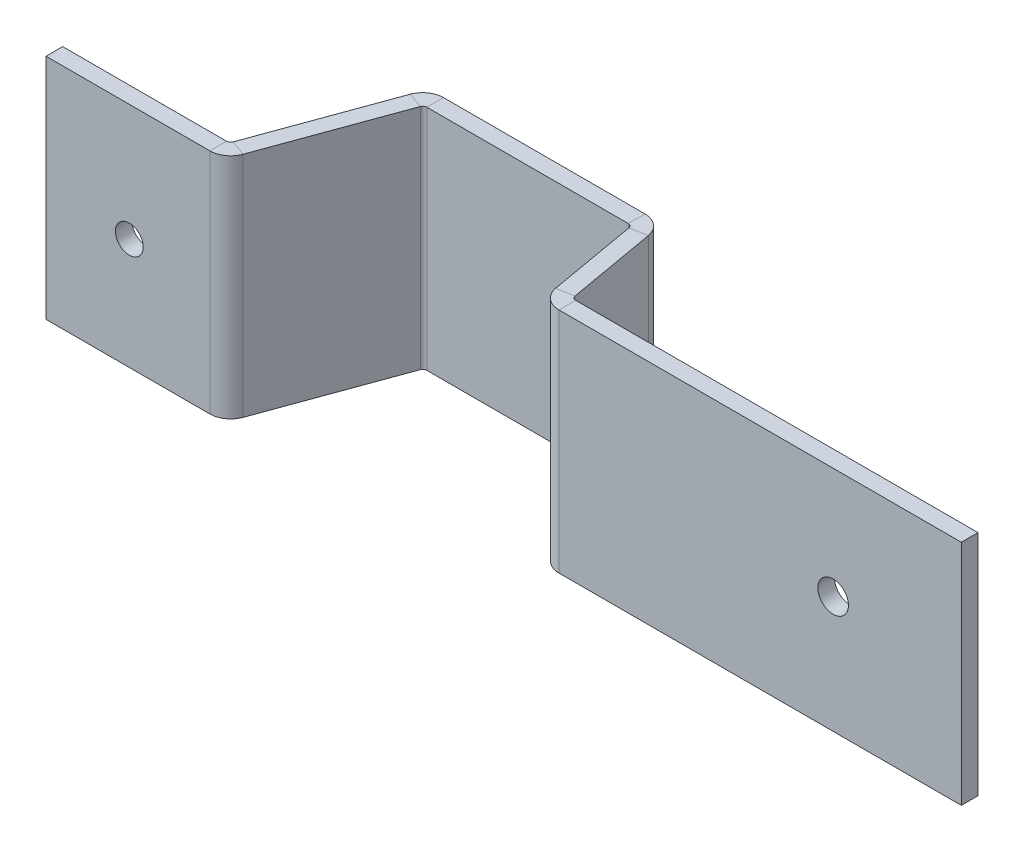
ISO-10303-21;
HEADER;
FILE_DESCRIPTION(('STEP AP214'),'2;1');
FILE_NAME('part.step','',(''),(''),'','','');
FILE_SCHEMA(('AUTOMOTIVE_DESIGN { 1 0 10303 214 1 1 1 1 }'));
ENDSEC;
DATA;
#1=APPLICATION_CONTEXT('core data for automotive mechanical design processes');
#2=APPLICATION_PROTOCOL_DEFINITION('international standard','automotive_design',2000,#1);
#3=PRODUCT_CONTEXT('',#1,'mechanical');
#4=PRODUCT('Part','Part','',(#3));
#5=PRODUCT_RELATED_PRODUCT_CATEGORY('part','',(#4));
#6=PRODUCT_DEFINITION_FORMATION('','',#4);
#7=PRODUCT_DEFINITION_CONTEXT('part definition',#1,'design');
#8=PRODUCT_DEFINITION('design','',#6,#7);
#9=PRODUCT_DEFINITION_SHAPE('','',#8);
#10=(LENGTH_UNIT() NAMED_UNIT(*) SI_UNIT(.MILLI.,.METRE.));
#11=(NAMED_UNIT(*) PLANE_ANGLE_UNIT() SI_UNIT($,.RADIAN.));
#12=(NAMED_UNIT(*) SI_UNIT($,.STERADIAN.) SOLID_ANGLE_UNIT());
#13=UNCERTAINTY_MEASURE_WITH_UNIT(LENGTH_MEASURE(1.E-05),#10,'distance_accuracy_value','');
#14=(GEOMETRIC_REPRESENTATION_CONTEXT(3) GLOBAL_UNCERTAINTY_ASSIGNED_CONTEXT((#13)) GLOBAL_UNIT_ASSIGNED_CONTEXT((#10,
#11,#12)) REPRESENTATION_CONTEXT('',''));
#15=CARTESIAN_POINT('',(0.,0.,0.));
#16=DIRECTION('',(0.,0.,1.));
#17=DIRECTION('',(1.,0.,0.));
#18=AXIS2_PLACEMENT_3D('',#15,#16,#17);
#19=CARTESIAN_POINT('',(30.1764047118256,41.,-0.484667962426315));
#20=DIRECTION('',(0.,1.,0.));
#21=DIRECTION('',(0.,0.,1.));
#22=AXIS2_PLACEMENT_3D('',#19,#20,#21);
#23=PLANE('',#22);
#24=DIRECTION('',(0.939692620785909,0.,0.342020143325666));
#25=VECTOR('',#24,1.);
#26=CARTESIAN_POINT('',(30.1764047118256,41.,-0.484667962426315));
#27=LINE('',#26,#25);
#28=CARTESIAN_POINT('',(30.1764047118256,41.,-0.484667962426315));
#29=VERTEX_POINT('',#28);
#30=CARTESIAN_POINT('',(32.9954825741834,41.,0.541392467550683));
#31=VERTEX_POINT('',#30);
#32=EDGE_CURVE('E11',#29,#31,#27,.T.);
#33=ORIENTED_EDGE('',*,*,#32,.F.);
#34=CARTESIAN_POINT('',(29.4842271273547,41.,-0.7366));
#35=DIRECTION('',(0.,-1.,0.));
#36=DIRECTION('',(0.,0.,-1.));
#37=AXIS2_PLACEMENT_3D('',#34,#35,#36);
#38=CIRCLE('',#37,0.7366);
#39=CARTESIAN_POINT('',(29.4842271273547,41.,0.));
#40=VERTEX_POINT('',#39);
#41=EDGE_CURVE('E368',#40,#29,#38,.F.);
#42=ORIENTED_EDGE('',*,*,#41,.F.);
#43=DIRECTION('',(0.,0.,-1.));
#44=VECTOR('',#43,1.);
#45=CARTESIAN_POINT('',(29.4842271273547,41.,3.));
#46=LINE('',#45,#44);
#47=CARTESIAN_POINT('',(29.4842271273547,41.,3.));
#48=VERTEX_POINT('',#47);
#49=EDGE_CURVE('E45',#48,#40,#46,.T.);
#50=ORIENTED_EDGE('',*,*,#49,.F.);
#51=CARTESIAN_POINT('',(29.4842271273547,41.,-0.7366));
#52=DIRECTION('',(0.,1.,0.));
#53=DIRECTION('',(1.,0.,0.));
#54=AXIS2_PLACEMENT_3D('',#51,#52,#53);
#55=CIRCLE('',#54,3.7366);
#56=EDGE_CURVE('E381',#48,#31,#55,.T.);
#57=ORIENTED_EDGE('',*,*,#56,.T.);
#58=EDGE_LOOP('',(#33,#42,#50,#57));
#59=FACE_BOUND('',#58,.T.);
#60=ADVANCED_FACE('F36',(#59),#23,.T.);
#61=CARTESIAN_POINT('',(29.4842271273547,41.,3.));
#62=DIRECTION('',(0.,1.,0.));
#63=DIRECTION('',(0.,0.,1.));
#64=AXIS2_PLACEMENT_3D('',#61,#62,#63);
#65=PLANE('',#64);
#66=DIRECTION('',(0.342020143325666,0.,-0.939692620785909));
#67=VECTOR('',#66,1.);
#68=CARTESIAN_POINT('',(30.,41.,0.));
#69=LINE('',#68,#67);
#70=CARTESIAN_POINT('',(38.6817040535644,41.,-23.8527858495562));
#71=VERTEX_POINT('',#70);
#72=EDGE_CURVE('E372',#29,#71,#69,.T.);
#73=ORIENTED_EDGE('',*,*,#72,.F.);
#74=ORIENTED_EDGE('',*,*,#32,.T.);
#75=DIRECTION('',(0.342020143325666,0.,-0.939692620785909));
#76=VECTOR('',#75,1.);
#77=CARTESIAN_POINT('',(32.8190778623577,41.,1.026060429977));
#78=LINE('',#77,#76);
#79=CARTESIAN_POINT('',(41.5007819159222,41.,-22.8267254195792));
#80=VERTEX_POINT('',#79);
#81=EDGE_CURVE('E383',#31,#80,#78,.T.);
#82=ORIENTED_EDGE('',*,*,#81,.T.);
#83=DIRECTION('',(-0.939692620785909,0.,-0.342020143325667));
#84=VECTOR('',#83,1.);
#85=CARTESIAN_POINT('',(41.5007819159222,41.,-22.8267254195792));
#86=LINE('',#85,#84);
#87=EDGE_CURVE('E341',#80,#71,#86,.T.);
#88=ORIENTED_EDGE('',*,*,#87,.T.);
#89=EDGE_LOOP('',(#73,#74,#82,#88));
#90=FACE_BOUND('',#89,.T.);
#91=ADVANCED_FACE('F453',(#90),#65,.T.);
#92=CARTESIAN_POINT('',(29.4842271273547,0.,0.));
#93=DIRECTION('',(0.,-1.,0.));
#94=DIRECTION('',(0.,0.,-1.));
#95=AXIS2_PLACEMENT_3D('',#92,#93,#94);
#96=PLANE('',#95);
#97=DIRECTION('',(0.,0.,1.));
#98=VECTOR('',#97,1.);
#99=CARTESIAN_POINT('',(29.4842271273547,0.,0.));
#100=LINE('',#99,#98);
#101=CARTESIAN_POINT('',(29.4842271273547,0.,0.));
#102=VERTEX_POINT('',#101);
#103=CARTESIAN_POINT('',(29.4842271273547,0.,3.));
#104=VERTEX_POINT('',#103);
#105=EDGE_CURVE('E347',#102,#104,#100,.T.);
#106=ORIENTED_EDGE('',*,*,#105,.F.);
#107=CARTESIAN_POINT('',(29.4842271273547,0.,-0.7366));
#108=DIRECTION('',(0.,-1.,0.));
#109=DIRECTION('',(0.,0.,-1.));
#110=AXIS2_PLACEMENT_3D('',#107,#108,#109);
#111=CIRCLE('',#110,0.7366);
#112=CARTESIAN_POINT('',(30.1764047118256,0.,-0.484667962426315));
#113=VERTEX_POINT('',#112);
#114=EDGE_CURVE('E251',#102,#113,#111,.F.);
#115=ORIENTED_EDGE('',*,*,#114,.T.);
#116=DIRECTION('',(-0.939692620785909,0.,-0.342020143325666));
#117=VECTOR('',#116,1.);
#118=CARTESIAN_POINT('',(32.9954825741834,0.,0.541392467550683));
#119=LINE('',#118,#117);
#120=CARTESIAN_POINT('',(32.9954825741834,0.,0.541392467550683));
#121=VERTEX_POINT('',#120);
#122=EDGE_CURVE('E345',#121,#113,#119,.T.);
#123=ORIENTED_EDGE('',*,*,#122,.F.);
#124=CARTESIAN_POINT('',(29.4842271273547,0.,-0.7366));
#125=DIRECTION('',(0.,1.,0.));
#126=DIRECTION('',(1.,0.,0.));
#127=AXIS2_PLACEMENT_3D('',#124,#125,#126);
#128=CIRCLE('',#127,3.7366);
#129=EDGE_CURVE('E263',#104,#121,#128,.T.);
#130=ORIENTED_EDGE('',*,*,#129,.F.);
#131=EDGE_LOOP('',(#106,#115,#123,#130));
#132=FACE_BOUND('',#131,.T.);
#133=ADVANCED_FACE('F495',(#132),#96,.T.);
#134=CARTESIAN_POINT('',(32.9954825741834,0.,0.541392467550683));
#135=DIRECTION('',(0.,-1.,0.));
#136=DIRECTION('',(0.,0.,-1.));
#137=AXIS2_PLACEMENT_3D('',#134,#135,#136);
#138=PLANE('',#137);
#139=DIRECTION('',(1.,0.,0.));
#140=VECTOR('',#139,1.);
#141=CARTESIAN_POINT('',(0.,0.,0.));
#142=LINE('',#141,#140);
#143=CARTESIAN_POINT('',(0.,0.,0.));
#144=VERTEX_POINT('',#143);
#145=EDGE_CURVE('E254',#144,#102,#142,.T.);
#146=ORIENTED_EDGE('',*,*,#145,.T.);
#147=ORIENTED_EDGE('',*,*,#105,.T.);
#148=DIRECTION('',(1.,0.,0.));
#149=VECTOR('',#148,1.);
#150=CARTESIAN_POINT('',(0.,0.,3.));
#151=LINE('',#150,#149);
#152=CARTESIAN_POINT('',(0.,0.,3.));
#153=VERTEX_POINT('',#152);
#154=EDGE_CURVE('E260',#153,#104,#151,.T.);
#155=ORIENTED_EDGE('',*,*,#154,.F.);
#156=DIRECTION('',(0.,0.,-1.));
#157=VECTOR('',#156,1.);
#158=CARTESIAN_POINT('',(0.,0.,3.));
#159=LINE('',#158,#157);
#160=EDGE_CURVE('E257',#153,#144,#159,.T.);
#161=ORIENTED_EDGE('',*,*,#160,.T.);
#162=EDGE_LOOP('',(#146,#147,#155,#161));
#163=FACE_BOUND('',#162,.T.);
#164=ADVANCED_FACE('F499',(#163),#138,.T.);
#165=CARTESIAN_POINT('',(42.1929595003931,41.,-26.3113933820055));
#166=DIRECTION('',(0.,1.,0.));
#167=DIRECTION('',(0.,0.,1.));
#168=AXIS2_PLACEMENT_3D('',#165,#166,#167);
#169=PLANE('',#168);
#170=DIRECTION('',(0.,0.,1.));
#171=VECTOR('',#170,1.);
#172=CARTESIAN_POINT('',(42.1929595003931,41.,-26.3113933820055));
#173=LINE('',#172,#171);
#174=CARTESIAN_POINT('',(42.1929595003931,41.,-26.3113933820055));
#175=VERTEX_POINT('',#174);
#176=CARTESIAN_POINT('',(42.1929595003931,41.,-23.3113933820055));
#177=VERTEX_POINT('',#176);
#178=EDGE_CURVE('E343',#175,#177,#173,.T.);
#179=ORIENTED_EDGE('',*,*,#178,.F.);
#180=CARTESIAN_POINT('',(42.1929595003931,41.,-22.5747933820055));
#181=DIRECTION('',(0.,1.,0.));
#182=DIRECTION('',(0.,0.,1.));
#183=AXIS2_PLACEMENT_3D('',#180,#181,#182);
#184=CIRCLE('',#183,3.7366);
#185=EDGE_CURVE('E443',#71,#175,#184,.F.);
#186=ORIENTED_EDGE('',*,*,#185,.F.);
#187=ORIENTED_EDGE('',*,*,#87,.F.);
#188=CARTESIAN_POINT('',(42.1929595003931,41.,-22.5747933820055));
#189=DIRECTION('',(0.,1.,0.));
#190=DIRECTION('',(1.,0.,0.));
#191=AXIS2_PLACEMENT_3D('',#188,#189,#190);
#192=CIRCLE('',#191,0.7366);
#193=EDGE_CURVE('E386',#80,#177,#192,.F.);
#194=ORIENTED_EDGE('',*,*,#193,.T.);
#195=EDGE_LOOP('',(#179,#186,#187,#194));
#196=FACE_BOUND('',#195,.T.);
#197=ADVANCED_FACE('F460',(#196),#169,.T.);
#198=CARTESIAN_POINT('',(41.5007819159222,41.,-22.8267254195792));
#199=DIRECTION('',(0.,1.,0.));
#200=DIRECTION('',(0.,0.,1.));
#201=AXIS2_PLACEMENT_3D('',#198,#199,#200);
#202=PLANE('',#201);
#203=DIRECTION('',(1.,0.,0.));
#204=VECTOR('',#203,1.);
#205=CARTESIAN_POINT('',(39.5765640131186,41.,-26.3113933820055));
#206=LINE('',#205,#204);
#207=CARTESIAN_POINT('',(78.4411843312616,41.,-26.3113933820055));
#208=VERTEX_POINT('',#207);
#209=EDGE_CURVE('E440',#175,#208,#206,.T.);
#210=ORIENTED_EDGE('',*,*,#209,.F.);
#211=ORIENTED_EDGE('',*,*,#178,.T.);
#212=DIRECTION('',(1.,0.,0.));
#213=VECTOR('',#212,1.);
#214=CARTESIAN_POINT('',(39.5765640131186,41.,-23.3113933820055));
#215=LINE('',#214,#213);
#216=CARTESIAN_POINT('',(78.4411843312616,41.,-23.3113933820055));
#217=VERTEX_POINT('',#216);
#218=EDGE_CURVE('E204',#177,#217,#215,.T.);
#219=ORIENTED_EDGE('',*,*,#218,.T.);
#220=DIRECTION('',(0.,0.,-1.));
#221=VECTOR('',#220,1.);
#222=CARTESIAN_POINT('',(78.4411843312616,41.,-23.3113933820055));
#223=LINE('',#222,#221);
#224=EDGE_CURVE('E195',#217,#208,#223,.T.);
#225=ORIENTED_EDGE('',*,*,#224,.T.);
#226=EDGE_LOOP('',(#210,#211,#219,#225));
#227=FACE_BOUND('',#226,.T.);
#228=ADVANCED_FACE('F392',(#227),#202,.T.);
#229=CARTESIAN_POINT('',(38.6817040535644,0.,-23.8527858495562));
#230=DIRECTION('',(0.,-1.,0.));
#231=DIRECTION('',(0.,0.,-1.));
#232=AXIS2_PLACEMENT_3D('',#229,#230,#231);
#233=PLANE('',#232);
#234=DIRECTION('',(0.939692620785909,0.,0.342020143325667));
#235=VECTOR('',#234,1.);
#236=CARTESIAN_POINT('',(38.6817040535644,0.,-23.8527858495562));
#237=LINE('',#236,#235);
#238=CARTESIAN_POINT('',(38.6817040535644,0.,-23.8527858495562));
#239=VERTEX_POINT('',#238);
#240=CARTESIAN_POINT('',(41.5007819159222,0.,-22.8267254195792));
#241=VERTEX_POINT('',#240);
#242=EDGE_CURVE('E339',#239,#241,#237,.T.);
#243=ORIENTED_EDGE('',*,*,#242,.F.);
#244=CARTESIAN_POINT('',(42.1929595003931,0.,-22.5747933820055));
#245=DIRECTION('',(0.,1.,0.));
#246=DIRECTION('',(0.,0.,1.));
#247=AXIS2_PLACEMENT_3D('',#244,#245,#246);
#248=CIRCLE('',#247,3.7366);
#249=CARTESIAN_POINT('',(42.1929595003931,0.,-26.3113933820055));
#250=VERTEX_POINT('',#249);
#251=EDGE_CURVE('E245',#239,#250,#248,.F.);
#252=ORIENTED_EDGE('',*,*,#251,.T.);
#253=DIRECTION('',(0.,0.,-1.));
#254=VECTOR('',#253,1.);
#255=CARTESIAN_POINT('',(42.1929595003931,0.,-23.3113933820055));
#256=LINE('',#255,#254);
#257=CARTESIAN_POINT('',(42.1929595003931,0.,-23.3113933820055));
#258=VERTEX_POINT('',#257);
#259=EDGE_CURVE('E194',#258,#250,#256,.T.);
#260=ORIENTED_EDGE('',*,*,#259,.F.);
#261=CARTESIAN_POINT('',(42.1929595003931,0.,-22.5747933820055));
#262=DIRECTION('',(0.,1.,0.));
#263=DIRECTION('',(1.,0.,0.));
#264=AXIS2_PLACEMENT_3D('',#261,#262,#263);
#265=CIRCLE('',#264,0.7366);
#266=EDGE_CURVE('E269',#241,#258,#265,.F.);
#267=ORIENTED_EDGE('',*,*,#266,.F.);
#268=EDGE_LOOP('',(#243,#252,#260,#267));
#269=FACE_BOUND('',#268,.T.);
#270=ADVANCED_FACE('F469',(#269),#233,.T.);
#271=CARTESIAN_POINT('',(42.1929595003931,0.,-23.3113933820055));
#272=DIRECTION('',(0.,-1.,0.));
#273=DIRECTION('',(0.,0.,-1.));
#274=AXIS2_PLACEMENT_3D('',#271,#272,#273);
#275=PLANE('',#274);
#276=DIRECTION('',(0.342020143325666,0.,-0.939692620785909));
#277=VECTOR('',#276,1.);
#278=CARTESIAN_POINT('',(30.,0.,0.));
#279=LINE('',#278,#277);
#280=EDGE_CURVE('E248',#113,#239,#279,.T.);
#281=ORIENTED_EDGE('',*,*,#280,.T.);
#282=ORIENTED_EDGE('',*,*,#242,.T.);
#283=DIRECTION('',(0.342020143325666,0.,-0.939692620785909));
#284=VECTOR('',#283,1.);
#285=CARTESIAN_POINT('',(32.8190778623577,0.,1.026060429977));
#286=LINE('',#285,#284);
#287=EDGE_CURVE('E266',#121,#241,#286,.T.);
#288=ORIENTED_EDGE('',*,*,#287,.F.);
#289=ORIENTED_EDGE('',*,*,#122,.T.);
#290=EDGE_LOOP('',(#281,#282,#288,#289));
#291=FACE_BOUND('',#290,.T.);
#292=ADVANCED_FACE('F473',(#291),#275,.T.);
#293=CARTESIAN_POINT('',(82.121016981167,41.,-23.2236471626757));
#294=DIRECTION('',(0.,1.,0.));
#295=DIRECTION('',(0.,0.,1.));
#296=AXIS2_PLACEMENT_3D('',#293,#294,#295);
#297=PLANE('',#296);
#298=DIRECTION('',(-0.984807753012208,0.,0.17364817766693));
#299=VECTOR('',#298,1.);
#300=CARTESIAN_POINT('',(82.121016981167,41.,-23.2236471626757));
#301=LINE('',#300,#299);
#302=CARTESIAN_POINT('',(82.121016981167,41.,-23.2236471626757));
#303=VERTEX_POINT('',#302);
#304=CARTESIAN_POINT('',(79.1665937221304,41.,-22.7027026296749));
#305=VERTEX_POINT('',#304);
#306=EDGE_CURVE('E182',#303,#305,#301,.T.);
#307=ORIENTED_EDGE('',*,*,#306,.F.);
#308=CARTESIAN_POINT('',(78.4411843312616,41.,-22.5747933820055));
#309=DIRECTION('',(0.,1.,0.));
#310=DIRECTION('',(0.,0.,1.));
#311=AXIS2_PLACEMENT_3D('',#308,#309,#310);
#312=CIRCLE('',#311,3.7366);
#313=EDGE_CURVE('E404',#208,#303,#312,.F.);
#314=ORIENTED_EDGE('',*,*,#313,.F.);
#315=ORIENTED_EDGE('',*,*,#224,.F.);
#316=CARTESIAN_POINT('',(78.4411843312616,41.,-22.5747933820055));
#317=DIRECTION('',(0.,1.,0.));
#318=DIRECTION('',(1.,0.,0.));
#319=AXIS2_PLACEMENT_3D('',#316,#317,#318);
#320=CIRCLE('',#319,0.7366);
#321=EDGE_CURVE('E198',#217,#305,#320,.F.);
#322=ORIENTED_EDGE('',*,*,#321,.T.);
#323=EDGE_LOOP('',(#307,#314,#315,#322));
#324=FACE_BOUND('',#323,.T.);
#325=ADVANCED_FACE('F200',(#324),#297,.T.);
#326=CARTESIAN_POINT('',(78.4411843312616,41.,-23.3113933820055));
#327=DIRECTION('',(0.,1.,0.));
#328=DIRECTION('',(0.,0.,1.));
#329=AXIS2_PLACEMENT_3D('',#326,#327,#328);
#330=PLANE('',#329);
#331=DIRECTION('',(0.173648177666928,0.,0.984807753012208));
#332=VECTOR('',#331,1.);
#333=CARTESIAN_POINT('',(81.5765640131187,41.,-26.3113933820055));
#334=LINE('',#333,#332);
#335=CARTESIAN_POINT('',(84.9421989639136,41.,-7.22392907409184));
#336=VERTEX_POINT('',#335);
#337=EDGE_CURVE('E189',#303,#336,#334,.T.);
#338=ORIENTED_EDGE('',*,*,#337,.F.);
#339=ORIENTED_EDGE('',*,*,#306,.T.);
#340=DIRECTION('',(0.173648177666928,0.,0.984807753012209));
#341=VECTOR('',#340,1.);
#342=CARTESIAN_POINT('',(78.622140754082,41.,-25.7904488490047));
#343=LINE('',#342,#341);
#344=CARTESIAN_POINT('',(81.987775704877,41.,-6.70298454109105));
#345=VERTEX_POINT('',#344);
#346=EDGE_CURVE('E186',#305,#345,#343,.T.);
#347=ORIENTED_EDGE('',*,*,#346,.T.);
#348=DIRECTION('',(0.984807753012208,0.,-0.17364817766693));
#349=VECTOR('',#348,1.);
#350=CARTESIAN_POINT('',(81.987775704877,41.,-6.70298454109105));
#351=LINE('',#350,#349);
#352=EDGE_CURVE('E330',#345,#336,#351,.T.);
#353=ORIENTED_EDGE('',*,*,#352,.T.);
#354=EDGE_LOOP('',(#338,#339,#347,#353));
#355=FACE_BOUND('',#354,.T.);
#356=ADVANCED_FACE('F184',(#355),#330,.T.);
#357=CARTESIAN_POINT('',(78.4411843312616,0.,-26.3113933820055));
#358=DIRECTION('',(0.,-1.,0.));
#359=DIRECTION('',(0.,0.,-1.));
#360=AXIS2_PLACEMENT_3D('',#357,#358,#359);
#361=PLANE('',#360);
#362=DIRECTION('',(0.,0.,1.));
#363=VECTOR('',#362,1.);
#364=CARTESIAN_POINT('',(78.4411843312616,0.,-26.3113933820055));
#365=LINE('',#364,#363);
#366=CARTESIAN_POINT('',(78.4411843312616,0.,-26.3113933820055));
#367=VERTEX_POINT('',#366);
#368=CARTESIAN_POINT('',(78.4411843312616,0.,-23.3113933820055));
#369=VERTEX_POINT('',#368);
#370=EDGE_CURVE('E335',#367,#369,#365,.T.);
#371=ORIENTED_EDGE('',*,*,#370,.F.);
#372=CARTESIAN_POINT('',(78.4411843312616,0.,-22.5747933820055));
#373=DIRECTION('',(0.,1.,0.));
#374=DIRECTION('',(0.,0.,1.));
#375=AXIS2_PLACEMENT_3D('',#372,#373,#374);
#376=CIRCLE('',#375,3.7366);
#377=CARTESIAN_POINT('',(82.121016981167,0.,-23.2236471626757));
#378=VERTEX_POINT('',#377);
#379=EDGE_CURVE('E239',#367,#378,#376,.F.);
#380=ORIENTED_EDGE('',*,*,#379,.T.);
#381=DIRECTION('',(0.984807753012208,0.,-0.17364817766693));
#382=VECTOR('',#381,1.);
#383=CARTESIAN_POINT('',(79.1665937221304,0.,-22.7027026296749));
#384=LINE('',#383,#382);
#385=CARTESIAN_POINT('',(79.1665937221304,0.,-22.7027026296749));
#386=VERTEX_POINT('',#385);
#387=EDGE_CURVE('E333',#386,#378,#384,.T.);
#388=ORIENTED_EDGE('',*,*,#387,.F.);
#389=CARTESIAN_POINT('',(78.4411843312616,0.,-22.5747933820055));
#390=DIRECTION('',(0.,1.,0.));
#391=DIRECTION('',(1.,0.,0.));
#392=AXIS2_PLACEMENT_3D('',#389,#390,#391);
#393=CIRCLE('',#392,0.7366);
#394=EDGE_CURVE('E211',#369,#386,#393,.F.);
#395=ORIENTED_EDGE('',*,*,#394,.F.);
#396=EDGE_LOOP('',(#371,#380,#388,#395));
#397=FACE_BOUND('',#396,.T.);
#398=ADVANCED_FACE('F398',(#397),#361,.T.);
#399=CARTESIAN_POINT('',(79.1665937221304,0.,-22.7027026296749));
#400=DIRECTION('',(0.,-1.,0.));
#401=DIRECTION('',(0.,0.,-1.));
#402=AXIS2_PLACEMENT_3D('',#399,#400,#401);
#403=PLANE('',#402);
#404=DIRECTION('',(1.,0.,0.));
#405=VECTOR('',#404,1.);
#406=CARTESIAN_POINT('',(39.5765640131186,0.,-26.3113933820055));
#407=LINE('',#406,#405);
#408=EDGE_CURVE('E242',#250,#367,#407,.T.);
#409=ORIENTED_EDGE('',*,*,#408,.T.);
#410=ORIENTED_EDGE('',*,*,#370,.T.);
#411=DIRECTION('',(1.,0.,0.));
#412=VECTOR('',#411,1.);
#413=CARTESIAN_POINT('',(39.5765640131186,0.,-23.3113933820055));
#414=LINE('',#413,#412);
#415=EDGE_CURVE('E272',#258,#369,#414,.T.);
#416=ORIENTED_EDGE('',*,*,#415,.F.);
#417=ORIENTED_EDGE('',*,*,#259,.T.);
#418=EDGE_LOOP('',(#409,#410,#416,#417));
#419=FACE_BOUND('',#418,.T.);
#420=ADVANCED_FACE('F479',(#419),#403,.T.);
#421=CARTESIAN_POINT('',(85.6676083547824,41.,-6.6152383217613));
#422=DIRECTION('',(0.,1.,0.));
#423=DIRECTION('',(0.,0.,1.));
#424=AXIS2_PLACEMENT_3D('',#421,#422,#423);
#425=PLANE('',#424);
#426=DIRECTION('',(0.,0.,1.));
#427=VECTOR('',#426,1.);
#428=CARTESIAN_POINT('',(85.6676083547824,41.,-6.6152383217613));
#429=LINE('',#428,#427);
#430=CARTESIAN_POINT('',(85.6676083547824,41.,-6.6152383217613));
#431=VERTEX_POINT('',#430);
#432=CARTESIAN_POINT('',(85.6676083547824,41.,-3.6152383217613));
#433=VERTEX_POINT('',#432);
#434=EDGE_CURVE('E53',#431,#433,#429,.T.);
#435=ORIENTED_EDGE('',*,*,#434,.F.);
#436=CARTESIAN_POINT('',(85.6676083547824,41.,-7.3518383217613));
#437=DIRECTION('',(0.,-1.,0.));
#438=DIRECTION('',(0.,0.,-1.));
#439=AXIS2_PLACEMENT_3D('',#436,#437,#438);
#440=CIRCLE('',#439,0.7366);
#441=EDGE_CURVE('E432',#336,#431,#440,.F.);
#442=ORIENTED_EDGE('',*,*,#441,.F.);
#443=ORIENTED_EDGE('',*,*,#352,.F.);
#444=CARTESIAN_POINT('',(85.6676083547824,41.,-7.3518383217613));
#445=DIRECTION('',(0.,1.,0.));
#446=DIRECTION('',(1.,0.,0.));
#447=AXIS2_PLACEMENT_3D('',#444,#445,#446);
#448=CIRCLE('',#447,3.7366);
#449=EDGE_CURVE('E219',#345,#433,#448,.T.);
#450=ORIENTED_EDGE('',*,*,#449,.T.);
#451=EDGE_LOOP('',(#435,#442,#443,#450));
#452=FACE_BOUND('',#451,.T.);
#453=ADVANCED_FACE('F481',(#452),#425,.T.);
#454=CARTESIAN_POINT('',(81.987775704877,41.,-6.70298454109105));
#455=DIRECTION('',(0.,1.,0.));
#456=DIRECTION('',(0.,0.,1.));
#457=AXIS2_PLACEMENT_3D('',#454,#455,#456);
#458=PLANE('',#457);
#459=DIRECTION('',(1.,0.,0.));
#460=VECTOR('',#459,1.);
#461=CARTESIAN_POINT('',(85.0495275664572,41.,-6.6152383217613));
#462=LINE('',#461,#460);
#463=CARTESIAN_POINT('',(158.049527566457,41.,-6.6152383217613));
#464=VERTEX_POINT('',#463);
#465=EDGE_CURVE('E430',#431,#464,#462,.T.);
#466=ORIENTED_EDGE('',*,*,#465,.F.);
#467=ORIENTED_EDGE('',*,*,#434,.T.);
#468=DIRECTION('',(1.,0.,0.));
#469=VECTOR('',#468,1.);
#470=CARTESIAN_POINT('',(85.0495275664572,41.,-3.6152383217613));
#471=LINE('',#470,#469);
#472=CARTESIAN_POINT('',(158.049527566457,41.,-3.6152383217613));
#473=VERTEX_POINT('',#472);
#474=EDGE_CURVE('E131',#433,#473,#471,.T.);
#475=ORIENTED_EDGE('',*,*,#474,.T.);
#476=DIRECTION('',(0.,0.,1.));
#477=VECTOR('',#476,1.);
#478=CARTESIAN_POINT('',(158.049527566457,41.,-6.6152383217613));
#479=LINE('',#478,#477);
#480=EDGE_CURVE('E428',#464,#473,#479,.T.);
#481=ORIENTED_EDGE('',*,*,#480,.F.);
#482=EDGE_LOOP('',(#466,#467,#475,#481));
#483=FACE_BOUND('',#482,.T.);
#484=ADVANCED_FACE('F487',(#483),#458,.T.);
#485=CARTESIAN_POINT('',(84.9421989639136,0.,-7.22392907409184));
#486=DIRECTION('',(0.,-1.,0.));
#487=DIRECTION('',(0.,0.,-1.));
#488=AXIS2_PLACEMENT_3D('',#485,#486,#487);
#489=PLANE('',#488);
#490=DIRECTION('',(-0.984807753012208,0.,0.17364817766693));
#491=VECTOR('',#490,1.);
#492=CARTESIAN_POINT('',(84.9421989639136,0.,-7.22392907409184));
#493=LINE('',#492,#491);
#494=CARTESIAN_POINT('',(84.9421989639136,0.,-7.22392907409184));
#495=VERTEX_POINT('',#494);
#496=CARTESIAN_POINT('',(81.987775704877,0.,-6.70298454109105));
#497=VERTEX_POINT('',#496);
#498=EDGE_CURVE('E118',#495,#497,#493,.T.);
#499=ORIENTED_EDGE('',*,*,#498,.F.);
#500=CARTESIAN_POINT('',(85.6676083547824,0.,-7.3518383217613));
#501=DIRECTION('',(0.,-1.,0.));
#502=DIRECTION('',(0.,0.,-1.));
#503=AXIS2_PLACEMENT_3D('',#500,#501,#502);
#504=CIRCLE('',#503,0.7366);
#505=CARTESIAN_POINT('',(85.6676083547824,0.,-6.6152383217613));
#506=VERTEX_POINT('',#505);
#507=EDGE_CURVE('E235',#495,#506,#504,.F.);
#508=ORIENTED_EDGE('',*,*,#507,.T.);
#509=DIRECTION('',(0.,0.,-1.));
#510=VECTOR('',#509,1.);
#511=CARTESIAN_POINT('',(85.6676083547824,0.,-3.6152383217613));
#512=LINE('',#511,#510);
#513=CARTESIAN_POINT('',(85.6676083547824,0.,-3.6152383217613));
#514=VERTEX_POINT('',#513);
#515=EDGE_CURVE('E125',#514,#506,#512,.T.);
#516=ORIENTED_EDGE('',*,*,#515,.F.);
#517=CARTESIAN_POINT('',(85.6676083547824,0.,-7.3518383217613));
#518=DIRECTION('',(0.,1.,0.));
#519=DIRECTION('',(1.,0.,0.));
#520=AXIS2_PLACEMENT_3D('',#517,#518,#519);
#521=CIRCLE('',#520,3.7366);
#522=EDGE_CURVE('E278',#497,#514,#521,.T.);
#523=ORIENTED_EDGE('',*,*,#522,.F.);
#524=EDGE_LOOP('',(#499,#508,#516,#523));
#525=FACE_BOUND('',#524,.T.);
#526=ADVANCED_FACE('F415',(#525),#489,.T.);
#527=CARTESIAN_POINT('',(85.6676083547824,0.,-3.6152383217613));
#528=DIRECTION('',(0.,-1.,0.));
#529=DIRECTION('',(0.,0.,-1.));
#530=AXIS2_PLACEMENT_3D('',#527,#528,#529);
#531=PLANE('',#530);
#532=DIRECTION('',(0.173648177666928,0.,0.984807753012208));
#533=VECTOR('',#532,1.);
#534=CARTESIAN_POINT('',(81.5765640131187,0.,-26.3113933820055));
#535=LINE('',#534,#533);
#536=EDGE_CURVE('E237',#378,#495,#535,.T.);
#537=ORIENTED_EDGE('',*,*,#536,.T.);
#538=ORIENTED_EDGE('',*,*,#498,.T.);
#539=DIRECTION('',(0.173648177666928,0.,0.984807753012209));
#540=VECTOR('',#539,1.);
#541=CARTESIAN_POINT('',(78.622140754082,0.,-25.7904488490047));
#542=LINE('',#541,#540);
#543=EDGE_CURVE('E276',#386,#497,#542,.T.);
#544=ORIENTED_EDGE('',*,*,#543,.F.);
#545=ORIENTED_EDGE('',*,*,#387,.T.);
#546=EDGE_LOOP('',(#537,#538,#544,#545));
#547=FACE_BOUND('',#546,.T.);
#548=ADVANCED_FACE('F400',(#547),#531,.T.);
#549=CARTESIAN_POINT('',(85.0495275664572,41.,-3.6152383217613));
#550=DIRECTION('',(0.,0.,-1.));
#551=DIRECTION('',(-1.,0.,0.));
#552=AXIS2_PLACEMENT_3D('',#549,#550,#551);
#553=PLANE('',#552);
#554=CARTESIAN_POINT('',(134.991664350565,21.,-3.6152383217613));
#555=DIRECTION('',(0.,0.,1.));
#556=DIRECTION('',(1.,0.,0.));
#557=AXIS2_PLACEMENT_3D('',#554,#555,#556);
#558=CIRCLE('',#557,2.75000000000001);
#559=CARTESIAN_POINT('',(137.741664350565,21.,-3.6152383217613));
#560=VERTEX_POINT('',#559);
#561=EDGE_CURVE('E904',#560,#560,#558,.T.);
#562=ORIENTED_EDGE('',*,*,#561,.F.);
#563=EDGE_LOOP('',(#562));
#564=FACE_BOUND('',#563,.T.);
#565=DIRECTION('',(1.,0.,0.));
#566=VECTOR('',#565,1.);
#567=CARTESIAN_POINT('',(85.0495275664572,0.,-3.6152383217613));
#568=LINE('',#567,#566);
#569=CARTESIAN_POINT('',(158.049527566457,0.,-3.6152383217613));
#570=VERTEX_POINT('',#569);
#571=EDGE_CURVE('E225',#514,#570,#568,.T.);
#572=ORIENTED_EDGE('',*,*,#571,.T.);
#573=DIRECTION('',(0.,-1.,0.));
#574=VECTOR('',#573,1.);
#575=CARTESIAN_POINT('',(158.049527566457,41.,-3.6152383217613));
#576=LINE('',#575,#574);
#577=EDGE_CURVE('E326',#473,#570,#576,.T.);
#578=ORIENTED_EDGE('',*,*,#577,.F.);
#579=ORIENTED_EDGE('',*,*,#474,.F.);
#580=DIRECTION('',(0.,-1.,0.));
#581=VECTOR('',#580,1.);
#582=CARTESIAN_POINT('',(85.6676083547824,41.,-3.6152383217613));
#583=LINE('',#582,#581);
#584=EDGE_CURVE('E221',#433,#514,#583,.T.);
#585=ORIENTED_EDGE('',*,*,#584,.T.);
#586=EDGE_LOOP('',(#572,#578,#579,#585));
#587=FACE_BOUND('',#586,.T.);
#588=ADVANCED_FACE('F421',(#564,#587),#553,.F.);
#589=CARTESIAN_POINT('',(158.049527566457,41.,-6.6152383217613));
#590=DIRECTION('',(1.,0.,0.));
#591=DIRECTION('',(0.,0.,-1.));
#592=AXIS2_PLACEMENT_3D('',#589,#590,#591);
#593=PLANE('',#592);
#594=DIRECTION('',(0.,0.,1.));
#595=VECTOR('',#594,1.);
#596=CARTESIAN_POINT('',(158.049527566457,0.,-6.6152383217613));
#597=LINE('',#596,#595);
#598=CARTESIAN_POINT('',(158.049527566457,0.,-6.6152383217613));
#599=VERTEX_POINT('',#598);
#600=EDGE_CURVE('E228',#599,#570,#597,.T.);
#601=ORIENTED_EDGE('',*,*,#600,.F.);
#602=DIRECTION('',(0.,-1.,0.));
#603=VECTOR('',#602,1.);
#604=CARTESIAN_POINT('',(158.049527566457,41.,-6.6152383217613));
#605=LINE('',#604,#603);
#606=EDGE_CURVE('E324',#464,#599,#605,.T.);
#607=ORIENTED_EDGE('',*,*,#606,.F.);
#608=ORIENTED_EDGE('',*,*,#480,.T.);
#609=ORIENTED_EDGE('',*,*,#577,.T.);
#610=EDGE_LOOP('',(#601,#607,#608,#609));
#611=FACE_BOUND('',#610,.T.);
#612=ADVANCED_FACE('F426',(#611),#593,.T.);
#613=CARTESIAN_POINT('',(85.0495275664572,41.,-6.6152383217613));
#614=DIRECTION('',(0.,0.,-1.));
#615=DIRECTION('',(-1.,0.,0.));
#616=AXIS2_PLACEMENT_3D('',#613,#614,#615);
#617=PLANE('',#616);
#618=CARTESIAN_POINT('',(134.991664350565,21.,-6.6152383217613));
#619=DIRECTION('',(0.,0.,-1.));
#620=DIRECTION('',(-1.,0.,0.));
#621=AXIS2_PLACEMENT_3D('',#618,#619,#620);
#622=CIRCLE('',#621,2.75000000000001);
#623=CARTESIAN_POINT('',(132.241664350565,21.,-6.6152383217613));
#624=VERTEX_POINT('',#623);
#625=EDGE_CURVE('E39',#624,#624,#622,.T.);
#626=ORIENTED_EDGE('',*,*,#625,.F.);
#627=EDGE_LOOP('',(#626));
#628=FACE_BOUND('',#627,.T.);
#629=DIRECTION('',(1.,0.,0.));
#630=VECTOR('',#629,1.);
#631=CARTESIAN_POINT('',(85.0495275664572,0.,-6.6152383217613));
#632=LINE('',#631,#630);
#633=EDGE_CURVE('E232',#506,#599,#632,.T.);
#634=ORIENTED_EDGE('',*,*,#633,.F.);
#635=DIRECTION('',(0.,-1.,0.));
#636=VECTOR('',#635,1.);
#637=CARTESIAN_POINT('',(85.6676083547824,41.,-6.6152383217613));
#638=LINE('',#637,#636);
#639=EDGE_CURVE('E321',#431,#506,#638,.T.);
#640=ORIENTED_EDGE('',*,*,#639,.F.);
#641=ORIENTED_EDGE('',*,*,#465,.T.);
#642=ORIENTED_EDGE('',*,*,#606,.T.);
#643=EDGE_LOOP('',(#634,#640,#641,#642));
#644=FACE_BOUND('',#643,.T.);
#645=ADVANCED_FACE('F576',(#628,#644),#617,.T.);
#646=CARTESIAN_POINT('',(85.6676083547824,41.,-7.3518383217613));
#647=DIRECTION('',(0.,-1.,0.));
#648=DIRECTION('',(0.,0.,-1.));
#649=AXIS2_PLACEMENT_3D('',#646,#647,#648);
#650=CYLINDRICAL_SURFACE('',#649,0.7366);
#651=ORIENTED_EDGE('',*,*,#507,.F.);
#652=DIRECTION('',(0.,-1.,0.));
#653=VECTOR('',#652,1.);
#654=CARTESIAN_POINT('',(84.9421989639136,41.,-7.22392907409184));
#655=LINE('',#654,#653);
#656=EDGE_CURVE('E318',#336,#495,#655,.T.);
#657=ORIENTED_EDGE('',*,*,#656,.F.);
#658=ORIENTED_EDGE('',*,*,#441,.T.);
#659=ORIENTED_EDGE('',*,*,#639,.T.);
#660=EDGE_LOOP('',(#651,#657,#658,#659));
#661=FACE_BOUND('',#660,.T.);
#662=ADVANCED_FACE('F412',(#661),#650,.F.);
#663=CARTESIAN_POINT('',(81.5765640131187,41.,-26.3113933820055));
#664=DIRECTION('',(0.984807753012208,0.,-0.173648177666928));
#665=DIRECTION('',(-0.173648177666928,0.,-0.984807753012208));
#666=AXIS2_PLACEMENT_3D('',#663,#664,#665);
#667=PLANE('',#666);
#668=ORIENTED_EDGE('',*,*,#536,.F.);
#669=DIRECTION('',(0.,-1.,0.));
#670=VECTOR('',#669,1.);
#671=CARTESIAN_POINT('',(82.121016981167,41.,-23.2236471626757));
#672=LINE('',#671,#670);
#673=EDGE_CURVE('E315',#303,#378,#672,.T.);
#674=ORIENTED_EDGE('',*,*,#673,.F.);
#675=ORIENTED_EDGE('',*,*,#337,.T.);
#676=ORIENTED_EDGE('',*,*,#656,.T.);
#677=EDGE_LOOP('',(#668,#674,#675,#676));
#678=FACE_BOUND('',#677,.T.);
#679=ADVANCED_FACE('F406',(#678),#667,.T.);
#680=CARTESIAN_POINT('',(78.4411843312616,41.,-22.5747933820055));
#681=DIRECTION('',(0.,-1.,0.));
#682=DIRECTION('',(0.,0.,-1.));
#683=AXIS2_PLACEMENT_3D('',#680,#681,#682);
#684=CYLINDRICAL_SURFACE('',#683,3.7366);
#685=ORIENTED_EDGE('',*,*,#379,.F.);
#686=DIRECTION('',(0.,-1.,0.));
#687=VECTOR('',#686,1.);
#688=CARTESIAN_POINT('',(78.4411843312616,41.,-26.3113933820055));
#689=LINE('',#688,#687);
#690=EDGE_CURVE('E312',#208,#367,#689,.T.);
#691=ORIENTED_EDGE('',*,*,#690,.F.);
#692=ORIENTED_EDGE('',*,*,#313,.T.);
#693=ORIENTED_EDGE('',*,*,#673,.T.);
#694=EDGE_LOOP('',(#685,#691,#692,#693));
#695=FACE_BOUND('',#694,.T.);
#696=ADVANCED_FACE('F403',(#695),#684,.T.);
#697=CARTESIAN_POINT('',(39.5765640131186,41.,-26.3113933820055));
#698=DIRECTION('',(0.,0.,-1.));
#699=DIRECTION('',(-1.,0.,0.));
#700=AXIS2_PLACEMENT_3D('',#697,#698,#699);
#701=PLANE('',#700);
#702=ORIENTED_EDGE('',*,*,#408,.F.);
#703=DIRECTION('',(0.,-1.,0.));
#704=VECTOR('',#703,1.);
#705=CARTESIAN_POINT('',(42.1929595003931,41.,-26.3113933820055));
#706=LINE('',#705,#704);
#707=EDGE_CURVE('E309',#175,#250,#706,.T.);
#708=ORIENTED_EDGE('',*,*,#707,.F.);
#709=ORIENTED_EDGE('',*,*,#209,.T.);
#710=ORIENTED_EDGE('',*,*,#690,.T.);
#711=EDGE_LOOP('',(#702,#708,#709,#710));
#712=FACE_BOUND('',#711,.T.);
#713=ADVANCED_FACE('F466',(#712),#701,.T.);
#714=CARTESIAN_POINT('',(42.1929595003931,41.,-22.5747933820055));
#715=DIRECTION('',(0.,-1.,0.));
#716=DIRECTION('',(0.,0.,-1.));
#717=AXIS2_PLACEMENT_3D('',#714,#715,#716);
#718=CYLINDRICAL_SURFACE('',#717,3.7366);
#719=ORIENTED_EDGE('',*,*,#251,.F.);
#720=DIRECTION('',(0.,-1.,0.));
#721=VECTOR('',#720,1.);
#722=CARTESIAN_POINT('',(38.6817040535644,41.,-23.8527858495562));
#723=LINE('',#722,#721);
#724=EDGE_CURVE('E306',#71,#239,#723,.T.);
#725=ORIENTED_EDGE('',*,*,#724,.F.);
#726=ORIENTED_EDGE('',*,*,#185,.T.);
#727=ORIENTED_EDGE('',*,*,#707,.T.);
#728=EDGE_LOOP('',(#719,#725,#726,#727));
#729=FACE_BOUND('',#728,.T.);
#730=ADVANCED_FACE('F459',(#729),#718,.T.);
#731=CARTESIAN_POINT('',(30.,41.,0.));
#732=DIRECTION('',(-0.939692620785909,0.,-0.342020143325666));
#733=DIRECTION('',(-0.342020143325666,0.,0.939692620785909));
#734=AXIS2_PLACEMENT_3D('',#731,#732,#733);
#735=PLANE('',#734);
#736=ORIENTED_EDGE('',*,*,#280,.F.);
#737=DIRECTION('',(0.,-1.,0.));
#738=VECTOR('',#737,1.);
#739=CARTESIAN_POINT('',(30.1764047118256,41.,-0.484667962426315));
#740=LINE('',#739,#738);
#741=EDGE_CURVE('E303',#29,#113,#740,.T.);
#742=ORIENTED_EDGE('',*,*,#741,.F.);
#743=ORIENTED_EDGE('',*,*,#72,.T.);
#744=ORIENTED_EDGE('',*,*,#724,.T.);
#745=EDGE_LOOP('',(#736,#742,#743,#744));
#746=FACE_BOUND('',#745,.T.);
#747=ADVANCED_FACE('F449',(#746),#735,.T.);
#748=CARTESIAN_POINT('',(29.4842271273547,41.,-0.7366));
#749=DIRECTION('',(0.,-1.,0.));
#750=DIRECTION('',(0.,0.,-1.));
#751=AXIS2_PLACEMENT_3D('',#748,#749,#750);
#752=CYLINDRICAL_SURFACE('',#751,0.7366);
#753=ORIENTED_EDGE('',*,*,#114,.F.);
#754=DIRECTION('',(0.,-1.,0.));
#755=VECTOR('',#754,1.);
#756=CARTESIAN_POINT('',(29.4842271273547,41.,0.));
#757=LINE('',#756,#755);
#758=EDGE_CURVE('E300',#40,#102,#757,.T.);
#759=ORIENTED_EDGE('',*,*,#758,.F.);
#760=ORIENTED_EDGE('',*,*,#41,.T.);
#761=ORIENTED_EDGE('',*,*,#741,.T.);
#762=EDGE_LOOP('',(#753,#759,#760,#761));
#763=FACE_BOUND('',#762,.T.);
#764=ADVANCED_FACE('F367',(#763),#752,.F.);
#765=CARTESIAN_POINT('',(0.,41.,0.));
#766=DIRECTION('',(0.,0.,-1.));
#767=DIRECTION('',(-1.,0.,0.));
#768=AXIS2_PLACEMENT_3D('',#765,#766,#767);
#769=PLANE('',#768);
#770=CARTESIAN_POINT('',(14.9916643505649,20.,0.));
#771=DIRECTION('',(0.,0.,-1.));
#772=DIRECTION('',(-1.,0.,0.));
#773=AXIS2_PLACEMENT_3D('',#770,#771,#772);
#774=CIRCLE('',#773,2.5);
#775=CARTESIAN_POINT('',(12.491664350565,20.,0.));
#776=VERTEX_POINT('',#775);
#777=EDGE_CURVE('E229',#776,#776,#774,.T.);
#778=ORIENTED_EDGE('',*,*,#777,.F.);
#779=EDGE_LOOP('',(#778));
#780=FACE_BOUND('',#779,.T.);
#781=ORIENTED_EDGE('',*,*,#145,.F.);
#782=DIRECTION('',(0.,-1.,0.));
#783=VECTOR('',#782,1.);
#784=CARTESIAN_POINT('',(0.,41.,0.));
#785=LINE('',#784,#783);
#786=CARTESIAN_POINT('',(0.,41.,0.));
#787=VERTEX_POINT('',#786);
#788=EDGE_CURVE('E298',#787,#144,#785,.T.);
#789=ORIENTED_EDGE('',*,*,#788,.F.);
#790=DIRECTION('',(1.,0.,0.));
#791=VECTOR('',#790,1.);
#792=CARTESIAN_POINT('',(0.,41.,0.));
#793=LINE('',#792,#791);
#794=EDGE_CURVE('E356',#787,#40,#793,.T.);
#795=ORIENTED_EDGE('',*,*,#794,.T.);
#796=ORIENTED_EDGE('',*,*,#758,.T.);
#797=EDGE_LOOP('',(#781,#789,#795,#796));
#798=FACE_BOUND('',#797,.T.);
#799=ADVANCED_FACE('F374',(#780,#798),#769,.T.);
#800=CARTESIAN_POINT('',(0.,41.,3.));
#801=DIRECTION('',(-1.,0.,0.));
#802=DIRECTION('',(0.,0.,1.));
#803=AXIS2_PLACEMENT_3D('',#800,#801,#802);
#804=PLANE('',#803);
#805=ORIENTED_EDGE('',*,*,#160,.F.);
#806=DIRECTION('',(0.,-1.,0.));
#807=VECTOR('',#806,1.);
#808=CARTESIAN_POINT('',(0.,41.,3.));
#809=LINE('',#808,#807);
#810=CARTESIAN_POINT('',(0.,41.,3.));
#811=VERTEX_POINT('',#810);
#812=EDGE_CURVE('E296',#811,#153,#809,.T.);
#813=ORIENTED_EDGE('',*,*,#812,.F.);
#814=DIRECTION('',(0.,0.,-1.));
#815=VECTOR('',#814,1.);
#816=CARTESIAN_POINT('',(0.,41.,3.));
#817=LINE('',#816,#815);
#818=EDGE_CURVE('E375',#811,#787,#817,.T.);
#819=ORIENTED_EDGE('',*,*,#818,.T.);
#820=ORIENTED_EDGE('',*,*,#788,.T.);
#821=EDGE_LOOP('',(#805,#813,#819,#820));
#822=FACE_BOUND('',#821,.T.);
#823=ADVANCED_FACE('F649',(#822),#804,.T.);
#824=CARTESIAN_POINT('',(0.,41.,3.));
#825=DIRECTION('',(0.,0.,-1.));
#826=DIRECTION('',(-1.,0.,0.));
#827=AXIS2_PLACEMENT_3D('',#824,#825,#826);
#828=PLANE('',#827);
#829=CARTESIAN_POINT('',(14.9916643505649,20.,3.));
#830=DIRECTION('',(0.,0.,1.));
#831=DIRECTION('',(1.,0.,0.));
#832=AXIS2_PLACEMENT_3D('',#829,#830,#831);
#833=CIRCLE('',#832,2.5);
#834=CARTESIAN_POINT('',(17.4916643505649,20.,3.));
#835=VERTEX_POINT('',#834);
#836=EDGE_CURVE('E906',#835,#835,#833,.T.);
#837=ORIENTED_EDGE('',*,*,#836,.F.);
#838=EDGE_LOOP('',(#837));
#839=FACE_BOUND('',#838,.T.);
#840=ORIENTED_EDGE('',*,*,#154,.T.);
#841=DIRECTION('',(0.,-1.,0.));
#842=VECTOR('',#841,1.);
#843=CARTESIAN_POINT('',(29.4842271273547,41.,3.));
#844=LINE('',#843,#842);
#845=EDGE_CURVE('E293',#48,#104,#844,.T.);
#846=ORIENTED_EDGE('',*,*,#845,.F.);
#847=DIRECTION('',(1.,0.,0.));
#848=VECTOR('',#847,1.);
#849=CARTESIAN_POINT('',(0.,41.,3.));
#850=LINE('',#849,#848);
#851=EDGE_CURVE('E359',#811,#48,#850,.T.);
#852=ORIENTED_EDGE('',*,*,#851,.F.);
#853=ORIENTED_EDGE('',*,*,#812,.T.);
#854=EDGE_LOOP('',(#840,#846,#852,#853));
#855=FACE_BOUND('',#854,.T.);
#856=ADVANCED_FACE('F654',(#839,#855),#828,.F.);
#857=CARTESIAN_POINT('',(29.4842271273547,41.,-0.7366));
#858=DIRECTION('',(0.,-1.,0.));
#859=DIRECTION('',(0.,0.,-1.));
#860=AXIS2_PLACEMENT_3D('',#857,#858,#859);
#861=CYLINDRICAL_SURFACE('',#860,3.7366);
#862=ORIENTED_EDGE('',*,*,#129,.T.);
#863=DIRECTION('',(0.,-1.,0.));
#864=VECTOR('',#863,1.);
#865=CARTESIAN_POINT('',(32.9954825741834,41.,0.541392467550683));
#866=LINE('',#865,#864);
#867=EDGE_CURVE('E290',#31,#121,#866,.T.);
#868=ORIENTED_EDGE('',*,*,#867,.F.);
#869=ORIENTED_EDGE('',*,*,#56,.F.);
#870=ORIENTED_EDGE('',*,*,#845,.T.);
#871=EDGE_LOOP('',(#862,#868,#869,#870));
#872=FACE_BOUND('',#871,.T.);
#873=ADVANCED_FACE('F663',(#872),#861,.T.);
#874=CARTESIAN_POINT('',(32.8190778623577,41.,1.026060429977));
#875=DIRECTION('',(-0.939692620785909,0.,-0.342020143325666));
#876=DIRECTION('',(-0.342020143325666,0.,0.939692620785909));
#877=AXIS2_PLACEMENT_3D('',#874,#875,#876);
#878=PLANE('',#877);
#879=ORIENTED_EDGE('',*,*,#287,.T.);
#880=DIRECTION('',(0.,-1.,0.));
#881=VECTOR('',#880,1.);
#882=CARTESIAN_POINT('',(41.5007819159222,41.,-22.8267254195792));
#883=LINE('',#882,#881);
#884=EDGE_CURVE('E287',#80,#241,#883,.T.);
#885=ORIENTED_EDGE('',*,*,#884,.F.);
#886=ORIENTED_EDGE('',*,*,#81,.F.);
#887=ORIENTED_EDGE('',*,*,#867,.T.);
#888=EDGE_LOOP('',(#879,#885,#886,#887));
#889=FACE_BOUND('',#888,.T.);
#890=ADVANCED_FACE('F475',(#889),#878,.F.);
#891=CARTESIAN_POINT('',(42.1929595003931,41.,-22.5747933820055));
#892=DIRECTION('',(0.,-1.,0.));
#893=DIRECTION('',(0.,0.,-1.));
#894=AXIS2_PLACEMENT_3D('',#891,#892,#893);
#895=CYLINDRICAL_SURFACE('',#894,0.7366);
#896=ORIENTED_EDGE('',*,*,#266,.T.);
#897=DIRECTION('',(0.,-1.,0.));
#898=VECTOR('',#897,1.);
#899=CARTESIAN_POINT('',(42.1929595003931,41.,-23.3113933820055));
#900=LINE('',#899,#898);
#901=EDGE_CURVE('E284',#177,#258,#900,.T.);
#902=ORIENTED_EDGE('',*,*,#901,.F.);
#903=ORIENTED_EDGE('',*,*,#193,.F.);
#904=ORIENTED_EDGE('',*,*,#884,.T.);
#905=EDGE_LOOP('',(#896,#902,#903,#904));
#906=FACE_BOUND('',#905,.T.);
#907=ADVANCED_FACE('F478',(#906),#895,.F.);
#908=CARTESIAN_POINT('',(39.5765640131186,41.,-23.3113933820055));
#909=DIRECTION('',(0.,0.,-1.));
#910=DIRECTION('',(-1.,0.,0.));
#911=AXIS2_PLACEMENT_3D('',#908,#909,#910);
#912=PLANE('',#911);
#913=ORIENTED_EDGE('',*,*,#415,.T.);
#914=DIRECTION('',(0.,-1.,0.));
#915=VECTOR('',#914,1.);
#916=CARTESIAN_POINT('',(78.4411843312616,41.,-23.3113933820055));
#917=LINE('',#916,#915);
#918=EDGE_CURVE('E213',#217,#369,#917,.T.);
#919=ORIENTED_EDGE('',*,*,#918,.F.);
#920=ORIENTED_EDGE('',*,*,#218,.F.);
#921=ORIENTED_EDGE('',*,*,#901,.T.);
#922=EDGE_LOOP('',(#913,#919,#920,#921));
#923=FACE_BOUND('',#922,.T.);
#924=ADVANCED_FACE('F395',(#923),#912,.F.);
#925=CARTESIAN_POINT('',(78.4411843312616,41.,-22.5747933820055));
#926=DIRECTION('',(0.,-1.,0.));
#927=DIRECTION('',(0.,0.,-1.));
#928=AXIS2_PLACEMENT_3D('',#925,#926,#927);
#929=CYLINDRICAL_SURFACE('',#928,0.7366);
#930=ORIENTED_EDGE('',*,*,#394,.T.);
#931=DIRECTION('',(0.,-1.,0.));
#932=VECTOR('',#931,1.);
#933=CARTESIAN_POINT('',(79.1665937221304,41.,-22.7027026296749));
#934=LINE('',#933,#932);
#935=EDGE_CURVE('E208',#305,#386,#934,.T.);
#936=ORIENTED_EDGE('',*,*,#935,.F.);
#937=ORIENTED_EDGE('',*,*,#321,.F.);
#938=ORIENTED_EDGE('',*,*,#918,.T.);
#939=EDGE_LOOP('',(#930,#936,#937,#938));
#940=FACE_BOUND('',#939,.T.);
#941=ADVANCED_FACE('F209',(#940),#929,.F.);
#942=CARTESIAN_POINT('',(78.622140754082,41.,-25.7904488490047));
#943=DIRECTION('',(0.984807753012208,0.,-0.173648177666928));
#944=DIRECTION('',(-0.173648177666928,0.,-0.984807753012209));
#945=AXIS2_PLACEMENT_3D('',#942,#943,#944);
#946=PLANE('',#945);
#947=ORIENTED_EDGE('',*,*,#543,.T.);
#948=DIRECTION('',(0.,-1.,0.));
#949=VECTOR('',#948,1.);
#950=CARTESIAN_POINT('',(81.987775704877,41.,-6.70298454109105));
#951=LINE('',#950,#949);
#952=EDGE_CURVE('E214',#345,#497,#951,.T.);
#953=ORIENTED_EDGE('',*,*,#952,.F.);
#954=ORIENTED_EDGE('',*,*,#346,.F.);
#955=ORIENTED_EDGE('',*,*,#935,.T.);
#956=EDGE_LOOP('',(#947,#953,#954,#955));
#957=FACE_BOUND('',#956,.T.);
#958=ADVANCED_FACE('F216',(#957),#946,.F.);
#959=CARTESIAN_POINT('',(85.6676083547824,41.,-7.3518383217613));
#960=DIRECTION('',(0.,-1.,0.));
#961=DIRECTION('',(0.,0.,-1.));
#962=AXIS2_PLACEMENT_3D('',#959,#960,#961);
#963=CYLINDRICAL_SURFACE('',#962,3.7366);
#964=ORIENTED_EDGE('',*,*,#522,.T.);
#965=ORIENTED_EDGE('',*,*,#584,.F.);
#966=ORIENTED_EDGE('',*,*,#449,.F.);
#967=ORIENTED_EDGE('',*,*,#952,.T.);
#968=EDGE_LOOP('',(#964,#965,#966,#967));
#969=FACE_BOUND('',#968,.T.);
#970=ADVANCED_FACE('F418',(#969),#963,.T.);
#971=CARTESIAN_POINT('',(85.6676083547824,41.,-7.3518383217613));
#972=DIRECTION('',(0.,-1.,0.));
#973=DIRECTION('',(-1.,0.,0.));
#974=AXIS2_PLACEMENT_3D('',#971,#972,#973);
#975=PLANE('',#974);
#976=ORIENTED_EDGE('',*,*,#851,.T.);
#977=ORIENTED_EDGE('',*,*,#49,.T.);
#978=ORIENTED_EDGE('',*,*,#794,.F.);
#979=ORIENTED_EDGE('',*,*,#818,.F.);
#980=EDGE_LOOP('',(#976,#977,#978,#979));
#981=FACE_BOUND('',#980,.T.);
#982=ADVANCED_FACE('F353',(#981),#975,.F.);
#983=CARTESIAN_POINT('',(85.6676083547824,0.,-7.3518383217613));
#984=DIRECTION('',(0.,-1.,0.));
#985=DIRECTION('',(-1.,0.,0.));
#986=AXIS2_PLACEMENT_3D('',#983,#984,#985);
#987=PLANE('',#986);
#988=ORIENTED_EDGE('',*,*,#571,.F.);
#989=ORIENTED_EDGE('',*,*,#515,.T.);
#990=ORIENTED_EDGE('',*,*,#633,.T.);
#991=ORIENTED_EDGE('',*,*,#600,.T.);
#992=EDGE_LOOP('',(#988,#989,#990,#991));
#993=FACE_BOUND('',#992,.T.);
#994=ADVANCED_FACE('F423',(#993),#987,.T.);
#995=CARTESIAN_POINT('',(14.9916643505649,20.,-7.));
#996=DIRECTION('',(0.,0.,1.));
#997=DIRECTION('',(1.,0.,0.));
#998=AXIS2_PLACEMENT_3D('',#995,#996,#997);
#999=CYLINDRICAL_SURFACE('',#998,2.5);
#1000=ORIENTED_EDGE('',*,*,#777,.T.);
#1001=EDGE_LOOP('',(#1000));
#1002=FACE_BOUND('',#1001,.T.);
#1003=ORIENTED_EDGE('',*,*,#836,.T.);
#1004=EDGE_LOOP('',(#1003));
#1005=FACE_BOUND('',#1004,.T.);
#1006=ADVANCED_FACE('F741',(#1002,#1005),#999,.F.);
#1007=CARTESIAN_POINT('',(134.991664350565,21.,-13.6152383217613));
#1008=DIRECTION('',(0.,0.,1.));
#1009=DIRECTION('',(1.,0.,0.));
#1010=AXIS2_PLACEMENT_3D('',#1007,#1008,#1009);
#1011=CYLINDRICAL_SURFACE('',#1010,2.75000000000001);
#1012=ORIENTED_EDGE('',*,*,#625,.T.);
#1013=EDGE_LOOP('',(#1012));
#1014=FACE_BOUND('',#1013,.T.);
#1015=ORIENTED_EDGE('',*,*,#561,.T.);
#1016=EDGE_LOOP('',(#1015));
#1017=FACE_BOUND('',#1016,.T.);
#1018=ADVANCED_FACE('F767',(#1014,#1017),#1011,.F.);
#1019=CLOSED_SHELL('',(#60,#91,#133,#164,#197,#228,#270,#292,#325,#356,#398,#420,#453,#484,#526,
#548,#588,#612,#645,#662,#679,#696,#713,#730,#747,#764,#799,#823,#856,#873,#890,#907,#924,#941,
#958,#970,#982,#994,#1006,#1018));
#1020=MANIFOLD_SOLID_BREP('B2',#1019);
#1021=ADVANCED_BREP_SHAPE_REPRESENTATION('',(#18,#1020),#14);
#1022=SHAPE_DEFINITION_REPRESENTATION(#9,#1021);
ENDSEC;
END-ISO-10303-21;
